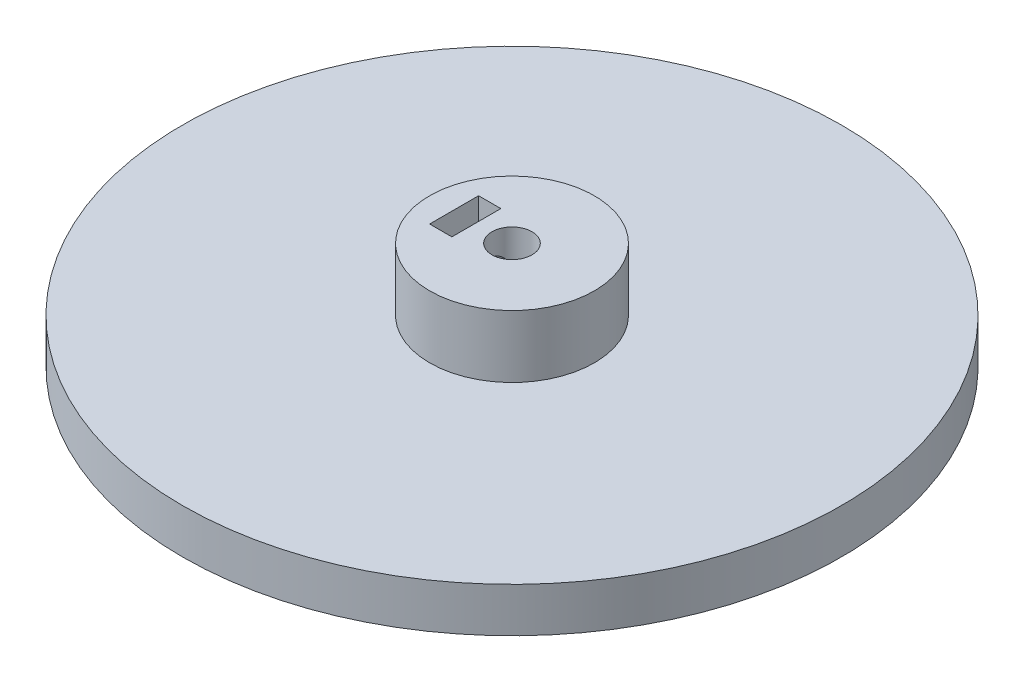
ISO-10303-21;
HEADER;
FILE_DESCRIPTION(('STEP AP214'),'2;1');
FILE_NAME('part.step','',(''),(''),'','','');
FILE_SCHEMA(('AUTOMOTIVE_DESIGN { 1 0 10303 214 1 1 1 1 }'));
ENDSEC;
DATA;
#1=APPLICATION_CONTEXT('core data for automotive mechanical design processes');
#2=APPLICATION_PROTOCOL_DEFINITION('international standard','automotive_design',2000,#1);
#3=PRODUCT_CONTEXT('',#1,'mechanical');
#4=PRODUCT('Part','Part','',(#3));
#5=PRODUCT_RELATED_PRODUCT_CATEGORY('part','',(#4));
#6=PRODUCT_DEFINITION_FORMATION('','',#4);
#7=PRODUCT_DEFINITION_CONTEXT('part definition',#1,'design');
#8=PRODUCT_DEFINITION('design','',#6,#7);
#9=PRODUCT_DEFINITION_SHAPE('','',#8);
#10=(LENGTH_UNIT() NAMED_UNIT(*) SI_UNIT(.MILLI.,.METRE.));
#11=(NAMED_UNIT(*) PLANE_ANGLE_UNIT() SI_UNIT($,.RADIAN.));
#12=(NAMED_UNIT(*) SI_UNIT($,.STERADIAN.) SOLID_ANGLE_UNIT());
#13=UNCERTAINTY_MEASURE_WITH_UNIT(LENGTH_MEASURE(1.E-05),#10,'distance_accuracy_value','');
#14=(GEOMETRIC_REPRESENTATION_CONTEXT(3) GLOBAL_UNCERTAINTY_ASSIGNED_CONTEXT((#13)) GLOBAL_UNIT_ASSIGNED_CONTEXT((#10,
#11,#12)) REPRESENTATION_CONTEXT('',''));
#15=CARTESIAN_POINT('',(0.,0.,0.));
#16=DIRECTION('',(0.,0.,1.));
#17=DIRECTION('',(1.,0.,0.));
#18=AXIS2_PLACEMENT_3D('',#15,#16,#17);
#19=CARTESIAN_POINT('',(-9.25,8.00000000000001,0.));
#20=DIRECTION('',(-1.,0.,0.));
#21=DIRECTION('',(0.,0.,1.));
#22=AXIS2_PLACEMENT_3D('',#19,#20,#21);
#23=CYLINDRICAL_SURFACE('',#22,1.49999999999999);
#24=CARTESIAN_POINT('',(-9.12756813176434,8.00000000000001,1.49999999999999));
#25=CARTESIAN_POINT('',(-9.12756961379572,7.91634082079124,1.49999661021083));
#26=CARTESIAN_POINT('',(-9.12873076571653,7.83263514801273,1.49297744928466));
#27=CARTESIAN_POINT('',(-9.13324598457221,7.66757010336968,1.46509713192922));
#28=CARTESIAN_POINT('',(-9.13660210646333,7.58621300486762,1.44422300404741));
#29=CARTESIAN_POINT('',(-9.14511738197225,7.42825797299914,1.38927881424645));
#30=CARTESIAN_POINT('',(-9.15027506296775,7.35165621259329,1.35521952762519));
#31=CARTESIAN_POINT('',(-9.1618105726406,7.20526363620867,1.27489827903223));
#32=CARTESIAN_POINT('',(-9.16818825542261,7.13547200733785,1.22863777590695));
#33=CARTESIAN_POINT('',(-9.18151171744077,7.00402012883349,1.12476634714105));
#34=CARTESIAN_POINT('',(-9.18846179819451,6.94243269423759,1.06706381173886));
#35=CARTESIAN_POINT('',(-9.2021086955797,6.82976949556864,0.942144220534594));
#36=CARTESIAN_POINT('',(-9.20880549749259,6.77869434162289,0.874926612864584));
#37=CARTESIAN_POINT('',(-9.22123667171939,6.68823351133476,0.732414580912544));
#38=CARTESIAN_POINT('',(-9.22696540122319,6.64891540823287,0.657076729672487));
#39=CARTESIAN_POINT('',(-9.23676715138083,6.58351891562005,0.500757553960185));
#40=CARTESIAN_POINT('',(-9.24084027400995,6.55743971064908,0.419776577430077));
#41=CARTESIAN_POINT('',(-9.24684151890069,6.51948347717741,0.255221571444729));
#42=CARTESIAN_POINT('',(-9.24878809283826,6.50748421098121,0.171676421197547));
#43=CARTESIAN_POINT('',(-9.25038026624867,6.49764851689902,0.00373743943041524));
#44=CARTESIAN_POINT('',(-9.25002601414402,6.49981117545063,-0.0806563369953943));
#45=CARTESIAN_POINT('',(-9.24707109469799,6.51814229391103,-0.247061672964748));
#46=CARTESIAN_POINT('',(-9.24449152582459,6.53417921453168,-0.329088150921278));
#47=CARTESIAN_POINT('',(-9.23739932897374,6.5795966833509,-0.489270225583665));
#48=CARTESIAN_POINT('',(-9.23288664460918,6.60897762078301,-0.567425709302183));
#49=CARTESIAN_POINT('',(-9.22239924004015,6.6803809316242,-0.718040384277853));
#50=CARTESIAN_POINT('',(-9.2164182344101,6.72245783473889,-0.79047326863777));
#51=CARTESIAN_POINT('',(-9.2036592734981,6.8180187573305,-0.927299884609038));
#52=CARTESIAN_POINT('',(-9.19688125709587,6.87150365190723,-0.991692998893613));
#53=CARTESIAN_POINT('',(-9.18319075875217,6.98909279386939,-1.11138886747759));
#54=CARTESIAN_POINT('',(-9.17627762658808,7.05331197535817,-1.16657869619509));
#55=CARTESIAN_POINT('',(-9.16317153842339,7.19015858542358,-1.26541725963211));
#56=CARTESIAN_POINT('',(-9.15697858839847,7.26278608375792,-1.30906589859287));
#57=CARTESIAN_POINT('',(-9.14601386051356,7.41451494268444,-1.38360330336041));
#58=CARTESIAN_POINT('',(-9.14124353617682,7.49362281995619,-1.41447903122703));
#59=CARTESIAN_POINT('',(-9.13368867194809,7.65599656046911,-1.46247296734354));
#60=CARTESIAN_POINT('',(-9.13090396708496,7.73926207766604,-1.47959231852892));
#61=CARTESIAN_POINT('',(-9.12766738510543,7.90657870206965,-1.4994296949627));
#62=CARTESIAN_POINT('',(-9.12718947413777,7.99061026645825,-1.50230844504066));
#63=CARTESIAN_POINT('',(-9.12855131127363,8.15795489179351,-1.49401069580292));
#64=CARTESIAN_POINT('',(-9.13039097482799,8.24126797883983,-1.48283470922853));
#65=CARTESIAN_POINT('',(-9.13615666306249,8.40430368772478,-1.44688156716498));
#66=CARTESIAN_POINT('',(-9.1400702086401,8.48404472349411,-1.42218573510396));
#67=CARTESIAN_POINT('',(-9.1495322822803,8.63825615767086,-1.35997902138551));
#68=CARTESIAN_POINT('',(-9.15508090343089,8.71272625569423,-1.32246741008183));
#69=CARTESIAN_POINT('',(-9.16724866645107,8.85499864892715,-1.23531271202269));
#70=CARTESIAN_POINT('',(-9.17387675153262,8.92273689128598,-1.18556633538191));
#71=CARTESIAN_POINT('',(-9.18743025134828,9.04896157743205,-1.07549650066911));
#72=CARTESIAN_POINT('',(-9.19435568581571,9.10744740598103,-1.01517233979035));
#73=CARTESIAN_POINT('',(-9.20780563662234,9.21409125413411,-0.884948421781169));
#74=CARTESIAN_POINT('',(-9.21432555088842,9.26214227413012,-0.814960492934597));
#75=CARTESIAN_POINT('',(-9.22615667201631,9.34580416140706,-0.667812378888741));
#76=CARTESIAN_POINT('',(-9.23146791634029,9.3814154142712,-0.590652416087808));
#77=CARTESIAN_POINT('',(-9.24026321723995,9.43901913448746,-0.431672917320961));
#78=CARTESIAN_POINT('',(-9.24375487074447,9.46106829532875,-0.349874361595183));
#79=CARTESIAN_POINT('',(-9.24854963020868,9.49110476107615,-0.18367436647687));
#80=CARTESIAN_POINT('',(-9.24985290624308,9.49909315874863,-0.0992731298768009));
#81=CARTESIAN_POINT('',(-9.25012185921934,9.50075122754273,0.0687022464538382));
#82=CARTESIAN_POINT('',(-9.24911415591773,9.49458395458987,0.152274779189828));
#83=CARTESIAN_POINT('',(-9.24492853079616,9.46845753984245,0.317177137703314));
#84=CARTESIAN_POINT('',(-9.24175061958081,9.44849846544079,0.398506974437605));
#85=CARTESIAN_POINT('',(-9.23358025943882,9.39541628356983,0.556557895469933));
#86=CARTESIAN_POINT('',(-9.22858962328955,9.36230632428355,0.63328349513212));
#87=CARTESIAN_POINT('',(-9.21733954702814,9.28388016826647,0.780115615781492));
#88=CARTESIAN_POINT('',(-9.21108005199444,9.23856344314734,0.850221850061978));
#89=CARTESIAN_POINT('',(-9.19790112724799,9.13642881112695,0.982648197405393));
#90=CARTESIAN_POINT('',(-9.19097526221434,9.07949121208692,1.04487536631752));
#91=CARTESIAN_POINT('',(-9.17728958577524,8.95598257098231,1.15895005293443));
#92=CARTESIAN_POINT('',(-9.17052981364965,8.88940927530738,1.21079513568228));
#93=CARTESIAN_POINT('',(-9.15789318259756,8.74799405957601,1.30294921406698));
#94=CARTESIAN_POINT('',(-9.15202250018991,8.67310005006342,1.3431791239384));
#95=CARTESIAN_POINT('',(-9.14190155529959,8.51755411246672,1.41042627400891));
#96=CARTESIAN_POINT('',(-9.13764965728718,8.43690809426031,1.43745685792027));
#97=CARTESIAN_POINT('',(-9.13220176185539,8.29661176179586,1.47159320135171));
#98=CARTESIAN_POINT('',(-9.13047368525064,8.23781592665538,1.48222888444103));
#99=CARTESIAN_POINT('',(-9.12815635095471,8.11935460728213,1.49643343440135));
#100=CARTESIAN_POINT('',(-9.12756707436484,8.05968913749774,1.50000241854621));
#101=CARTESIAN_POINT('',(-9.12756813176434,8.00000000000001,1.49999999999999));
#102=B_SPLINE_CURVE_WITH_KNOTS('',3,(#24,#25,#26,#27,#28,#29,#30,#31,#32,#33,#34,#35,#36,#37,
#38,#39,#40,#41,#42,#43,#44,#45,#46,#47,#48,#49,#50,#51,#52,#53,#54,#55,#56,#57,#58,#59,#60,#61,
#62,#63,#64,#65,#66,#67,#68,#69,#70,#71,#72,#73,#74,#75,#76,#77,#78,#79,#80,#81,#82,#83,#84,#85,
#86,#87,#88,#89,#90,#91,#92,#93,#94,#95,#96,#97,#98,#99,#100,#101),.UNSPECIFIED.,.T.,.F.,(4,2,2,
2,2,2,2,2,2,2,2,2,2,2,2,2,2,2,2,2,2,2,2,2,2,2,2,2,2,2,2,2,2,2,2,2,2,2,4),(0.,0.250759294371265,
0.501753689198186,0.752543395600703,1.00330312975107,1.25615810949107,1.50902776066677,
1.76332400706991,2.01760458800052,2.26966085500361,2.52170086243296,2.77137719051376,
3.02106080190677,3.27183246059755,3.52262336274645,3.77629528672222,4.02996931538121,
4.28390164649392,4.53781287769827,4.7888517265268,5.03988141728569,5.28941746648391,
5.5389677249933,5.79070179744272,6.04245260189259,6.29667429609398,6.5508881097365,
6.80403188211419,7.05715597993999,7.30737905269541,7.5576009027578,7.80757320957446,
8.0575563385599,8.3102574682332,8.56301779579385,8.81746059349515,9.07164562978001,
9.25056029927509,9.42947199960639),.UNSPECIFIED.);
#103=CARTESIAN_POINT('',(-9.12756813176434,8.00000000000001,1.49999999999999));
#104=VERTEX_POINT('',#103);
#105=EDGE_CURVE('E11',#104,#104,#102,.T.);
#106=ORIENTED_EDGE('',*,*,#105,.F.);
#107=EDGE_LOOP('',(#106));
#108=FACE_BOUND('',#107,.T.);
#109=CARTESIAN_POINT('',(-6.5,8.00000000000001,0.));
#110=DIRECTION('',(1.,0.,0.));
#111=DIRECTION('',(0.,0.,-1.));
#112=AXIS2_PLACEMENT_3D('',#109,#110,#111);
#113=CIRCLE('',#112,1.49999999999999);
#114=CARTESIAN_POINT('',(-6.5,8.00000000000001,-1.49999999999999));
#115=VERTEX_POINT('',#114);
#116=EDGE_CURVE('E127',#115,#115,#113,.F.);
#117=ORIENTED_EDGE('',*,*,#116,.F.);
#118=EDGE_LOOP('',(#117));
#119=FACE_BOUND('',#118,.T.);
#120=ADVANCED_FACE('F32',(#108,#119),#23,.F.);
#121=CARTESIAN_POINT('',(0.,5.,0.));
#122=DIRECTION('',(0.,-1.,0.));
#123=DIRECTION('',(0.,0.,-1.));
#124=AXIS2_PLACEMENT_3D('',#121,#122,#123);
#125=CYLINDRICAL_SURFACE('',#124,37.);
#126=CARTESIAN_POINT('',(0.,5.,0.));
#127=DIRECTION('',(0.,1.,0.));
#128=DIRECTION('',(0.,0.,1.));
#129=AXIS2_PLACEMENT_3D('',#126,#127,#128);
#130=CIRCLE('',#129,37.);
#131=CARTESIAN_POINT('',(0.,5.,37.));
#132=VERTEX_POINT('',#131);
#133=EDGE_CURVE('E223',#132,#132,#130,.T.);
#134=ORIENTED_EDGE('',*,*,#133,.F.);
#135=EDGE_LOOP('',(#134));
#136=FACE_BOUND('',#135,.T.);
#137=CARTESIAN_POINT('',(0.,0.,0.));
#138=DIRECTION('',(0.,1.,0.));
#139=DIRECTION('',(0.,0.,1.));
#140=AXIS2_PLACEMENT_3D('',#137,#138,#139);
#141=CIRCLE('',#140,37.);
#142=CARTESIAN_POINT('',(0.,0.,37.));
#143=VERTEX_POINT('',#142);
#144=EDGE_CURVE('E157',#143,#143,#141,.T.);
#145=ORIENTED_EDGE('',*,*,#144,.T.);
#146=EDGE_LOOP('',(#145));
#147=FACE_BOUND('',#146,.T.);
#148=ADVANCED_FACE('F34',(#136,#147),#125,.T.);
#149=CARTESIAN_POINT('',(0.,5.,0.));
#150=DIRECTION('',(0.,1.,0.));
#151=DIRECTION('',(0.,0.,1.));
#152=AXIS2_PLACEMENT_3D('',#149,#150,#151);
#153=PLANE('',#152);
#154=CARTESIAN_POINT('',(0.,5.,0.));
#155=DIRECTION('',(0.,1.,0.));
#156=DIRECTION('',(0.,0.,1.));
#157=AXIS2_PLACEMENT_3D('',#154,#155,#156);
#158=CIRCLE('',#157,9.25);
#159=CARTESIAN_POINT('',(0.,5.,9.25));
#160=VERTEX_POINT('',#159);
#161=EDGE_CURVE('E41',#160,#160,#158,.T.);
#162=ORIENTED_EDGE('',*,*,#161,.F.);
#163=EDGE_LOOP('',(#162));
#164=FACE_BOUND('',#163,.T.);
#165=ORIENTED_EDGE('',*,*,#133,.T.);
#166=EDGE_LOOP('',(#165));
#167=FACE_BOUND('',#166,.T.);
#168=ADVANCED_FACE('F165',(#164,#167),#153,.T.);
#169=CARTESIAN_POINT('',(0.,0.,0.));
#170=DIRECTION('',(0.,1.,0.));
#171=DIRECTION('',(0.,0.,1.));
#172=AXIS2_PLACEMENT_3D('',#169,#170,#171);
#173=PLANE('',#172);
#174=ORIENTED_EDGE('',*,*,#144,.F.);
#175=EDGE_LOOP('',(#174));
#176=FACE_BOUND('',#175,.T.);
#177=ADVANCED_FACE('F167',(#176),#173,.F.);
#178=CARTESIAN_POINT('',(0.,12.,0.));
#179=DIRECTION('',(0.,1.,0.));
#180=DIRECTION('',(0.,0.,1.));
#181=AXIS2_PLACEMENT_3D('',#178,#179,#180);
#182=PLANE('',#181);
#183=DIRECTION('',(0.,0.,1.));
#184=VECTOR('',#183,1.);
#185=CARTESIAN_POINT('',(-4.,12.,2.75));
#186=LINE('',#185,#184);
#187=CARTESIAN_POINT('',(-4.,12.,-2.75));
#188=VERTEX_POINT('',#187);
#189=CARTESIAN_POINT('',(-4.,12.,2.75));
#190=VERTEX_POINT('',#189);
#191=EDGE_CURVE('E120',#188,#190,#186,.T.);
#192=ORIENTED_EDGE('',*,*,#191,.T.);
#193=DIRECTION('',(-1.,0.,0.));
#194=VECTOR('',#193,1.);
#195=CARTESIAN_POINT('',(-4.,12.,2.75));
#196=LINE('',#195,#194);
#197=CARTESIAN_POINT('',(-6.5,12.,2.75));
#198=VERTEX_POINT('',#197);
#199=EDGE_CURVE('E124',#190,#198,#196,.T.);
#200=ORIENTED_EDGE('',*,*,#199,.T.);
#201=DIRECTION('',(0.,0.,1.));
#202=VECTOR('',#201,1.);
#203=CARTESIAN_POINT('',(-6.5,12.,2.75));
#204=LINE('',#203,#202);
#205=CARTESIAN_POINT('',(-6.5,12.,-2.75));
#206=VERTEX_POINT('',#205);
#207=EDGE_CURVE('E110',#206,#198,#204,.T.);
#208=ORIENTED_EDGE('',*,*,#207,.F.);
#209=DIRECTION('',(-1.,0.,0.));
#210=VECTOR('',#209,1.);
#211=CARTESIAN_POINT('',(-4.,12.,-2.75));
#212=LINE('',#211,#210);
#213=EDGE_CURVE('E49',#188,#206,#212,.T.);
#214=ORIENTED_EDGE('',*,*,#213,.F.);
#215=EDGE_LOOP('',(#192,#200,#208,#214));
#216=FACE_BOUND('',#215,.T.);
#217=CARTESIAN_POINT('',(0.,12.,0.));
#218=DIRECTION('',(0.,1.,0.));
#219=DIRECTION('',(0.,0.,1.));
#220=AXIS2_PLACEMENT_3D('',#217,#218,#219);
#221=CIRCLE('',#220,9.25);
#222=CARTESIAN_POINT('',(0.,12.,9.25));
#223=VERTEX_POINT('',#222);
#224=EDGE_CURVE('E218',#223,#223,#221,.T.);
#225=ORIENTED_EDGE('',*,*,#224,.T.);
#226=EDGE_LOOP('',(#225));
#227=FACE_BOUND('',#226,.T.);
#228=CARTESIAN_POINT('',(0.,12.,0.));
#229=DIRECTION('',(0.,1.,0.));
#230=DIRECTION('',(0.,0.,1.));
#231=AXIS2_PLACEMENT_3D('',#228,#229,#230);
#232=CIRCLE('',#231,2.25);
#233=CARTESIAN_POINT('',(0.,12.,2.25));
#234=VERTEX_POINT('',#233);
#235=EDGE_CURVE('E139',#234,#234,#232,.T.);
#236=ORIENTED_EDGE('',*,*,#235,.F.);
#237=EDGE_LOOP('',(#236));
#238=FACE_BOUND('',#237,.T.);
#239=ADVANCED_FACE('F163',(#216,#227,#238),#182,.T.);
#240=CARTESIAN_POINT('',(0.,12.,0.));
#241=DIRECTION('',(0.,-1.,0.));
#242=DIRECTION('',(0.,0.,-1.));
#243=AXIS2_PLACEMENT_3D('',#240,#241,#242);
#244=CYLINDRICAL_SURFACE('',#243,9.25);
#245=ORIENTED_EDGE('',*,*,#105,.T.);
#246=EDGE_LOOP('',(#245));
#247=FACE_BOUND('',#246,.T.);
#248=ORIENTED_EDGE('',*,*,#224,.F.);
#249=EDGE_LOOP('',(#248));
#250=FACE_BOUND('',#249,.T.);
#251=ORIENTED_EDGE('',*,*,#161,.T.);
#252=EDGE_LOOP('',(#251));
#253=FACE_BOUND('',#252,.T.);
#254=ADVANCED_FACE('F159',(#247,#250,#253),#244,.T.);
#255=CARTESIAN_POINT('',(0.,12.,0.));
#256=DIRECTION('',(0.,-1.,0.));
#257=DIRECTION('',(0.,0.,-1.));
#258=AXIS2_PLACEMENT_3D('',#255,#256,#257);
#259=CYLINDRICAL_SURFACE('',#258,2.25);
#260=CARTESIAN_POINT('',(-1.67705098312485,8.00000000000001,1.49999999999999));
#261=CARTESIAN_POINT('',(-1.67705815097113,7.92677876684854,1.49999590498298));
#262=CARTESIAN_POINT('',(-1.68193553285582,7.85353193471841,1.49459244377747));
#263=CARTESIAN_POINT('',(-1.70048979376213,7.7096600662619,1.47343701238298));
#264=CARTESIAN_POINT('',(-1.71418245609533,7.63903997335283,1.45766647940896));
#265=CARTESIAN_POINT('',(-1.74792439369178,7.50294841859175,1.41701896257473));
#266=CARTESIAN_POINT('',(-1.76791171345952,7.43743422744677,1.3922303851066));
#267=CARTESIAN_POINT('',(-1.81188071011369,7.31160062574001,1.33450506295153));
#268=CARTESIAN_POINT('',(-1.83586321619124,7.25128229751765,1.30156662609122));
#269=CARTESIAN_POINT('',(-1.8895955469902,7.12726483428733,1.22251807505785));
#270=CARTESIAN_POINT('',(-1.91966202067773,7.06450091171211,1.17515576588799));
#271=CARTESIAN_POINT('',(-1.97958620481062,6.9469979683443,1.07114414805509));
#272=CARTESIAN_POINT('',(-2.00944368223489,6.89226685875612,1.0144857988281));
#273=CARTESIAN_POINT('',(-2.0706661389281,6.78451725591376,0.883617678707211));
#274=CARTESIAN_POINT('',(-2.10162589385192,6.73288811616826,0.808054829743637));
#275=CARTESIAN_POINT('',(-2.15668863362073,6.64351842838246,0.64685322315917));
#276=CARTESIAN_POINT('',(-2.18079927173278,6.60576236447662,0.561225864241274));
#277=CARTESIAN_POINT('',(-2.21699930598544,6.54983269923692,0.392436805109999));
#278=CARTESIAN_POINT('',(-2.230133817119,6.52993749162834,0.31007604388606));
#279=CARTESIAN_POINT('',(-2.24707309096441,6.50436163303728,0.142271586547395));
#280=CARTESIAN_POINT('',(-2.25088960321769,6.49866308058093,0.0568319109643678));
#281=CARTESIAN_POINT('',(-2.24891521292215,6.5016293374618,-0.100610287674247));
#282=CARTESIAN_POINT('',(-2.24449698682595,6.50824178848781,-0.172680478506565));
#283=CARTESIAN_POINT('',(-2.22906137092515,6.53156828851919,-0.314428974953261));
#284=CARTESIAN_POINT('',(-2.21804349984826,6.54828307422767,-0.384107105737292));
#285=CARTESIAN_POINT('',(-2.19039068777802,6.59089676359595,-0.519058453253376));
#286=CARTESIAN_POINT('',(-2.17377808487009,6.61675916389893,-0.58434796788447));
#287=CARTESIAN_POINT('',(-2.13615828357216,6.67666523221463,-0.709656862990165));
#288=CARTESIAN_POINT('',(-2.11515028308871,6.71071039362615,-0.76967527872705));
#289=CARTESIAN_POINT('',(-2.06713543838027,6.79098405309493,-0.891213218972578));
#290=CARTESIAN_POINT('',(-2.03970306594019,6.83822564251461,-0.951893610747805));
#291=CARTESIAN_POINT('',(-1.98300451370248,6.94092400961026,-1.06499105623728));
#292=CARTESIAN_POINT('',(-1.95373554611423,6.99639345945037,-1.11739510139592));
#293=CARTESIAN_POINT('',(-1.89112533708115,7.12397240765998,-1.22079176494624));
#294=CARTESIAN_POINT('',(-1.85785740006702,7.19732830978587,-1.27030194844766));
#295=CARTESIAN_POINT('',(-1.79606708123319,7.35313237941556,-1.35626156209111));
#296=CARTESIAN_POINT('',(-1.76753678651157,7.43556499581046,-1.3927328899117));
#297=CARTESIAN_POINT('',(-1.72697152730175,7.58353929655482,-1.44249543425833));
#298=CARTESIAN_POINT('',(-1.71255273433275,7.64719502754261,-1.45943093810655));
#299=CARTESIAN_POINT('',(-1.69056779842186,7.77727961736271,-1.48484666685004));
#300=CARTESIAN_POINT('',(-1.68298977586679,7.84370345837971,-1.49334155223273));
#301=CARTESIAN_POINT('',(-1.67585667740618,7.9778322398309,-1.50134550111679));
#302=CARTESIAN_POINT('',(-1.67633650400182,8.04554148388924,-1.50081547314907));
#303=CARTESIAN_POINT('',(-1.68532410276386,8.17976287546716,-1.49071222287189));
#304=CARTESIAN_POINT('',(-1.6938383823541,8.24627400808379,-1.4811316701747));
#305=CARTESIAN_POINT('',(-1.71695983126729,8.3730420631593,-1.45424858390583));
#306=CARTESIAN_POINT('',(-1.73124890306573,8.43344578174068,-1.43734630898571));
#307=CARTESIAN_POINT('',(-1.76422468895976,8.550594677049,-1.39667281220291));
#308=CARTESIAN_POINT('',(-1.78291287955091,8.60733861726426,-1.37289928349942));
#309=CARTESIAN_POINT('',(-1.82708612716104,8.72765150283257,-1.31372509954688));
#310=CARTESIAN_POINT('',(-1.85318311153234,8.79031760844643,-1.27695021633904));
#311=CARTESIAN_POINT('',(-1.90696886184715,8.90931260174747,-1.19514548646837));
#312=CARTESIAN_POINT('',(-1.93465953733966,8.96563363749414,-1.15010558918906));
#313=CARTESIAN_POINT('',(-1.99556758712398,9.08297176067787,-1.04157493276896));
#314=CARTESIAN_POINT('',(-2.02867089096389,9.14232713620678,-0.976202898836782));
#315=CARTESIAN_POINT('',(-2.09081686388763,9.24936251218471,-0.834824616516371));
#316=CARTESIAN_POINT('',(-2.11986311093912,9.2970528284376,-0.758827858097504));
#317=CARTESIAN_POINT('',(-2.16593115930198,9.3709188041922,-0.613115606112488));
#318=CARTESIAN_POINT('',(-2.18419093582863,9.39946737833135,-0.544996773663699));
#319=CARTESIAN_POINT('',(-2.21459030900674,9.44645539573926,-0.404067809266406));
#320=CARTESIAN_POINT('',(-2.226735074041,9.46490337714454,-0.331261697894343));
#321=CARTESIAN_POINT('',(-2.24383773019954,9.49077272287935,-0.182527044227295));
#322=CARTESIAN_POINT('',(-2.24876363142371,9.49814500963008,-0.106586127693155));
#323=CARTESIAN_POINT('',(-2.2508236577182,9.50123588856275,0.045641659935483));
#324=CARTESIAN_POINT('',(-2.24795850704183,9.49695556396711,0.121928498215074));
#325=CARTESIAN_POINT('',(-2.23522166982986,9.47775538324649,0.266818149396105));
#326=CARTESIAN_POINT('',(-2.2258745790739,9.46363176135365,0.33557635730291));
#327=CARTESIAN_POINT('',(-2.20152079655201,9.42632149292682,0.469513817247798));
#328=CARTESIAN_POINT('',(-2.18651322560327,9.40313343848955,0.534692511515172));
#329=CARTESIAN_POINT('',(-2.15093824114645,9.34704597133698,0.663860472456269));
#330=CARTESIAN_POINT('',(-2.13009936709753,9.31366226937869,0.727562691900204));
#331=CARTESIAN_POINT('',(-2.08481556176604,9.23888701653051,0.84866449701239));
#332=CARTESIAN_POINT('',(-2.06036847483947,9.197490674036,0.906060279037518));
#333=CARTESIAN_POINT('',(-2.00544698604295,9.10052832324776,1.02247066651052));
#334=CARTESIAN_POINT('',(-1.97462935408027,9.04375773224447,1.08032009644569));
#335=CARTESIAN_POINT('',(-1.91290018237115,8.92166484384061,1.18620016711197));
#336=CARTESIAN_POINT('',(-1.88198858977616,8.85633620837442,1.23422346242942));
#337=CARTESIAN_POINT('',(-1.82538160192724,8.72309930693353,1.31634940138808));
#338=CARTESIAN_POINT('',(-1.79946815056428,8.65576864253724,1.35123485172907));
#339=CARTESIAN_POINT('',(-1.75310626193267,8.51503666325513,1.41086851755204));
#340=CARTESIAN_POINT('',(-1.73264723471479,8.44164747960338,1.43563642711));
#341=CARTESIAN_POINT('',(-1.70393288947155,8.30692139868159,1.4695219685318));
#342=CARTESIAN_POINT('',(-1.69397771557614,8.24651882240727,1.48089171279936));
#343=CARTESIAN_POINT('',(-1.68053639412007,8.1240826996216,1.49612936864194));
#344=CARTESIAN_POINT('',(-1.67704490881107,8.06205054180457,1.50000347027786));
#345=CARTESIAN_POINT('',(-1.67705098312485,8.00000000000001,1.49999999999999));
#346=B_SPLINE_CURVE_WITH_KNOTS('',3,(#260,#261,#262,#263,#264,#265,#266,#267,#268,#269,#270,
#271,#272,#273,#274,#275,#276,#277,#278,#279,#280,#281,#282,#283,#284,#285,#286,#287,#288,#289,
#290,#291,#292,#293,#294,#295,#296,#297,#298,#299,#300,#301,#302,#303,#304,#305,#306,#307,#308,
#309,#310,#311,#312,#313,#314,#315,#316,#317,#318,#319,#320,#321,#322,#323,#324,#325,#326,#327,
#328,#329,#330,#331,#332,#333,#334,#335,#336,#337,#338,#339,#340,#341,#342,#343,#344,#345),
.UNSPECIFIED.,.T.,.F.,(4,2,2,2,2,2,2,2,2,2,2,2,2,2,2,2,2,2,2,2,2,2,2,2,2,2,2,2,2,2,2,2,2,2,2,2,
2,2,2,2,2,2,4),(0.,0.219380198041614,0.439154281694465,0.656829488412203,0.874549929499115,
1.12616007801478,1.37801638827206,1.66625273254716,1.95416572041434,2.20978111547684,
2.46507402516223,2.68154651216805,2.89803478712808,3.11366873979892,3.32934207677249,
3.57335644459975,3.81775061097477,4.10009027628706,4.38195352307959,4.58344567800992,
4.78458724676613,4.98660028228525,5.18877707677946,5.381073387802,5.57343433233716,
5.80424422538313,6.03533667599893,6.31691013389483,6.59823367928196,6.82552935457534,
7.05263259665115,7.28073921948384,7.50882463833369,7.72032586686057,7.93185995918388,
8.15563397238185,8.37954221947075,8.63866654712146,8.89798387812713,9.13750594346299,
9.37655952485679,9.56262462226951,9.74853599747833),.UNSPECIFIED.);
#347=CARTESIAN_POINT('',(-1.67705098312485,8.00000000000001,1.49999999999999));
#348=VERTEX_POINT('',#347);
#349=EDGE_CURVE('E131',#348,#348,#346,.T.);
#350=ORIENTED_EDGE('',*,*,#349,.F.);
#351=EDGE_LOOP('',(#350));
#352=FACE_BOUND('',#351,.T.);
#353=ORIENTED_EDGE('',*,*,#235,.T.);
#354=EDGE_LOOP('',(#353));
#355=FACE_BOUND('',#354,.T.);
#356=CARTESIAN_POINT('',(0.,3.,0.));
#357=DIRECTION('',(0.,1.,0.));
#358=DIRECTION('',(0.,0.,1.));
#359=AXIS2_PLACEMENT_3D('',#356,#357,#358);
#360=CIRCLE('',#359,2.25);
#361=CARTESIAN_POINT('',(0.,3.,2.25));
#362=VERTEX_POINT('',#361);
#363=EDGE_CURVE('E128',#362,#362,#360,.T.);
#364=ORIENTED_EDGE('',*,*,#363,.F.);
#365=EDGE_LOOP('',(#364));
#366=FACE_BOUND('',#365,.T.);
#367=ADVANCED_FACE('F141',(#352,#355,#366),#259,.F.);
#368=CARTESIAN_POINT('',(-4.,8.00000000000001,0.));
#369=DIRECTION('',(1.,0.,0.));
#370=DIRECTION('',(0.,0.,-1.));
#371=AXIS2_PLACEMENT_3D('',#368,#369,#370);
#372=CIRCLE('',#371,1.49999999999999);
#373=CARTESIAN_POINT('',(-4.,8.00000000000001,-1.49999999999999));
#374=VERTEX_POINT('',#373);
#375=EDGE_CURVE('E36',#374,#374,#372,.F.);
#376=ORIENTED_EDGE('',*,*,#375,.T.);
#377=EDGE_LOOP('',(#376));
#378=FACE_BOUND('',#377,.T.);
#379=ORIENTED_EDGE('',*,*,#349,.T.);
#380=EDGE_LOOP('',(#379));
#381=FACE_BOUND('',#380,.T.);
#382=ADVANCED_FACE('F144',(#378,#381),#23,.F.);
#383=CARTESIAN_POINT('',(0.,3.,0.));
#384=DIRECTION('',(0.,1.,0.));
#385=DIRECTION('',(0.,0.,1.));
#386=AXIS2_PLACEMENT_3D('',#383,#384,#385);
#387=PLANE('',#386);
#388=ORIENTED_EDGE('',*,*,#363,.T.);
#389=EDGE_LOOP('',(#388));
#390=FACE_BOUND('',#389,.T.);
#391=ADVANCED_FACE('F148',(#390),#387,.T.);
#392=CARTESIAN_POINT('',(-4.,0.,0.));
#393=DIRECTION('',(1.,0.,0.));
#394=DIRECTION('',(0.,0.,-1.));
#395=AXIS2_PLACEMENT_3D('',#392,#393,#394);
#396=PLANE('',#395);
#397=ORIENTED_EDGE('',*,*,#191,.F.);
#398=DIRECTION('',(0.,1.,0.));
#399=VECTOR('',#398,1.);
#400=CARTESIAN_POINT('',(-4.,6.41228675972854,-2.75));
#401=LINE('',#400,#399);
#402=CARTESIAN_POINT('',(-4.,6.41228675972854,-2.75));
#403=VERTEX_POINT('',#402);
#404=EDGE_CURVE('E55',#403,#188,#401,.T.);
#405=ORIENTED_EDGE('',*,*,#404,.F.);
#406=DIRECTION('',(0.,0.5,-0.866025403784439));
#407=VECTOR('',#406,1.);
#408=CARTESIAN_POINT('',(-4.,4.82457351945707,0.));
#409=LINE('',#408,#407);
#410=CARTESIAN_POINT('',(-4.,4.82457351945707,0.));
#411=VERTEX_POINT('',#410);
#412=EDGE_CURVE('E98',#411,#403,#409,.T.);
#413=ORIENTED_EDGE('',*,*,#412,.F.);
#414=DIRECTION('',(0.,-0.5,-0.866025403784439));
#415=VECTOR('',#414,1.);
#416=CARTESIAN_POINT('',(-4.,6.41228675972854,2.75));
#417=LINE('',#416,#415);
#418=CARTESIAN_POINT('',(-4.,6.41228675972854,2.75));
#419=VERTEX_POINT('',#418);
#420=EDGE_CURVE('E90',#419,#411,#417,.T.);
#421=ORIENTED_EDGE('',*,*,#420,.F.);
#422=DIRECTION('',(0.,-1.,0.));
#423=VECTOR('',#422,1.);
#424=CARTESIAN_POINT('',(-4.,12.,2.75));
#425=LINE('',#424,#423);
#426=EDGE_CURVE('E83',#190,#419,#425,.T.);
#427=ORIENTED_EDGE('',*,*,#426,.F.);
#428=EDGE_LOOP('',(#397,#405,#413,#421,#427));
#429=FACE_BOUND('',#428,.T.);
#430=ORIENTED_EDGE('',*,*,#375,.F.);
#431=EDGE_LOOP('',(#430));
#432=FACE_BOUND('',#431,.T.);
#433=ADVANCED_FACE('F104',(#429,#432),#396,.F.);
#434=CARTESIAN_POINT('',(-6.5,0.,0.));
#435=DIRECTION('',(1.,0.,0.));
#436=DIRECTION('',(0.,0.,-1.));
#437=AXIS2_PLACEMENT_3D('',#434,#435,#436);
#438=PLANE('',#437);
#439=ORIENTED_EDGE('',*,*,#207,.T.);
#440=DIRECTION('',(0.,-1.,0.));
#441=VECTOR('',#440,1.);
#442=CARTESIAN_POINT('',(-6.5,12.,2.75));
#443=LINE('',#442,#441);
#444=CARTESIAN_POINT('',(-6.5,6.41228675972854,2.75));
#445=VERTEX_POINT('',#444);
#446=EDGE_CURVE('E113',#198,#445,#443,.T.);
#447=ORIENTED_EDGE('',*,*,#446,.T.);
#448=DIRECTION('',(0.,-0.5,-0.866025403784439));
#449=VECTOR('',#448,1.);
#450=CARTESIAN_POINT('',(-6.5,6.41228675972854,2.75));
#451=LINE('',#450,#449);
#452=CARTESIAN_POINT('',(-6.5,4.82457351945707,0.));
#453=VERTEX_POINT('',#452);
#454=EDGE_CURVE('E115',#445,#453,#451,.T.);
#455=ORIENTED_EDGE('',*,*,#454,.T.);
#456=DIRECTION('',(0.,0.5,-0.866025403784439));
#457=VECTOR('',#456,1.);
#458=CARTESIAN_POINT('',(-6.5,4.82457351945707,0.));
#459=LINE('',#458,#457);
#460=CARTESIAN_POINT('',(-6.5,6.41228675972854,-2.75));
#461=VERTEX_POINT('',#460);
#462=EDGE_CURVE('E75',#453,#461,#459,.T.);
#463=ORIENTED_EDGE('',*,*,#462,.T.);
#464=DIRECTION('',(0.,1.,0.));
#465=VECTOR('',#464,1.);
#466=CARTESIAN_POINT('',(-6.5,6.41228675972854,-2.75));
#467=LINE('',#466,#465);
#468=EDGE_CURVE('E118',#461,#206,#467,.T.);
#469=ORIENTED_EDGE('',*,*,#468,.T.);
#470=EDGE_LOOP('',(#439,#447,#455,#463,#469));
#471=FACE_BOUND('',#470,.T.);
#472=ORIENTED_EDGE('',*,*,#116,.T.);
#473=EDGE_LOOP('',(#472));
#474=FACE_BOUND('',#473,.T.);
#475=ADVANCED_FACE('F191',(#471,#474),#438,.T.);
#476=CARTESIAN_POINT('',(-4.,12.,2.75));
#477=DIRECTION('',(0.,0.,-1.));
#478=DIRECTION('',(0.,1.,0.));
#479=AXIS2_PLACEMENT_3D('',#476,#477,#478);
#480=PLANE('',#479);
#481=ORIENTED_EDGE('',*,*,#446,.F.);
#482=ORIENTED_EDGE('',*,*,#199,.F.);
#483=ORIENTED_EDGE('',*,*,#426,.T.);
#484=DIRECTION('',(-1.,0.,0.));
#485=VECTOR('',#484,1.);
#486=CARTESIAN_POINT('',(-4.,6.41228675972854,2.75));
#487=LINE('',#486,#485);
#488=EDGE_CURVE('E96',#419,#445,#487,.T.);
#489=ORIENTED_EDGE('',*,*,#488,.T.);
#490=EDGE_LOOP('',(#481,#482,#483,#489));
#491=FACE_BOUND('',#490,.T.);
#492=ADVANCED_FACE('F197',(#491),#480,.T.);
#493=CARTESIAN_POINT('',(-4.,6.41228675972854,2.75));
#494=DIRECTION('',(0.,0.866025403784439,-0.5));
#495=DIRECTION('',(0.,0.5,0.866025403784439));
#496=AXIS2_PLACEMENT_3D('',#493,#494,#495);
#497=PLANE('',#496);
#498=ORIENTED_EDGE('',*,*,#454,.F.);
#499=ORIENTED_EDGE('',*,*,#488,.F.);
#500=ORIENTED_EDGE('',*,*,#420,.T.);
#501=DIRECTION('',(-1.,0.,0.));
#502=VECTOR('',#501,1.);
#503=CARTESIAN_POINT('',(-4.,4.82457351945707,0.));
#504=LINE('',#503,#502);
#505=EDGE_CURVE('E94',#411,#453,#504,.T.);
#506=ORIENTED_EDGE('',*,*,#505,.T.);
#507=EDGE_LOOP('',(#498,#499,#500,#506));
#508=FACE_BOUND('',#507,.T.);
#509=ADVANCED_FACE('F93',(#508),#497,.T.);
#510=CARTESIAN_POINT('',(-4.,4.82457351945707,0.));
#511=DIRECTION('',(0.,0.866025403784439,0.5));
#512=DIRECTION('',(0.,-0.5,0.866025403784439));
#513=AXIS2_PLACEMENT_3D('',#510,#511,#512);
#514=PLANE('',#513);
#515=ORIENTED_EDGE('',*,*,#462,.F.);
#516=ORIENTED_EDGE('',*,*,#505,.F.);
#517=ORIENTED_EDGE('',*,*,#412,.T.);
#518=DIRECTION('',(-1.,0.,0.));
#519=VECTOR('',#518,1.);
#520=CARTESIAN_POINT('',(-4.,6.41228675972854,-2.75));
#521=LINE('',#520,#519);
#522=EDGE_CURVE('E102',#403,#461,#521,.T.);
#523=ORIENTED_EDGE('',*,*,#522,.T.);
#524=EDGE_LOOP('',(#515,#516,#517,#523));
#525=FACE_BOUND('',#524,.T.);
#526=ADVANCED_FACE('F101',(#525),#514,.T.);
#527=CARTESIAN_POINT('',(-4.,6.41228675972854,-2.75));
#528=DIRECTION('',(0.,0.,1.));
#529=DIRECTION('',(0.,-1.,0.));
#530=AXIS2_PLACEMENT_3D('',#527,#528,#529);
#531=PLANE('',#530);
#532=ORIENTED_EDGE('',*,*,#468,.F.);
#533=ORIENTED_EDGE('',*,*,#522,.F.);
#534=ORIENTED_EDGE('',*,*,#404,.T.);
#535=ORIENTED_EDGE('',*,*,#213,.T.);
#536=EDGE_LOOP('',(#532,#533,#534,#535));
#537=FACE_BOUND('',#536,.T.);
#538=ADVANCED_FACE('F201',(#537),#531,.T.);
#539=CLOSED_SHELL('',(#120,#148,#168,#177,#239,#254,#367,#382,#391,#433,#475,#492,#509,#526,#538));
#540=MANIFOLD_SOLID_BREP('B2',#539);
#541=ADVANCED_BREP_SHAPE_REPRESENTATION('',(#18,#540),#14);
#542=SHAPE_DEFINITION_REPRESENTATION(#9,#541);
ENDSEC;
END-ISO-10303-21;
